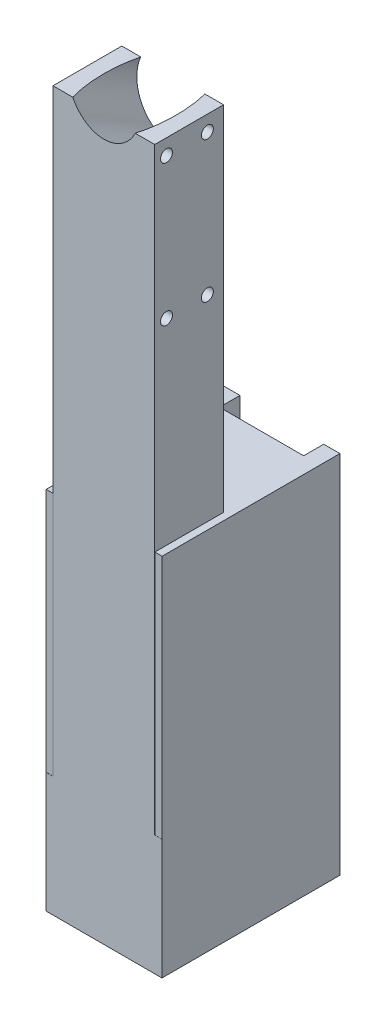
ISO-10303-21;
HEADER;
FILE_DESCRIPTION(('STEP AP214'),'2;1');
FILE_NAME('part.step','',(''),(''),'','','');
FILE_SCHEMA(('AUTOMOTIVE_DESIGN { 1 0 10303 214 1 1 1 1 }'));
ENDSEC;
DATA;
#1=APPLICATION_CONTEXT('core data for automotive mechanical design processes');
#2=APPLICATION_PROTOCOL_DEFINITION('international standard','automotive_design',2000,#1);
#3=PRODUCT_CONTEXT('',#1,'mechanical');
#4=PRODUCT('Part','Part','',(#3));
#5=PRODUCT_RELATED_PRODUCT_CATEGORY('part','',(#4));
#6=PRODUCT_DEFINITION_FORMATION('','',#4);
#7=PRODUCT_DEFINITION_CONTEXT('part definition',#1,'design');
#8=PRODUCT_DEFINITION('design','',#6,#7);
#9=PRODUCT_DEFINITION_SHAPE('','',#8);
#10=(LENGTH_UNIT() NAMED_UNIT(*) SI_UNIT(.MILLI.,.METRE.));
#11=(NAMED_UNIT(*) PLANE_ANGLE_UNIT() SI_UNIT($,.RADIAN.));
#12=(NAMED_UNIT(*) SI_UNIT($,.STERADIAN.) SOLID_ANGLE_UNIT());
#13=UNCERTAINTY_MEASURE_WITH_UNIT(LENGTH_MEASURE(1.E-05),#10,'distance_accuracy_value','');
#14=(GEOMETRIC_REPRESENTATION_CONTEXT(3) GLOBAL_UNCERTAINTY_ASSIGNED_CONTEXT((#13)) GLOBAL_UNIT_ASSIGNED_CONTEXT((#10,
#11,#12)) REPRESENTATION_CONTEXT('',''));
#15=CARTESIAN_POINT('',(0.,0.,0.));
#16=DIRECTION('',(0.,0.,1.));
#17=DIRECTION('',(1.,0.,0.));
#18=AXIS2_PLACEMENT_3D('',#15,#16,#17);
#19=CARTESIAN_POINT('',(19.2072159267695,-16.068623136154,-106.10825784731));
#20=DIRECTION('',(0.,1.,0.));
#21=DIRECTION('',(0.,0.,1.));
#22=AXIS2_PLACEMENT_3D('',#19,#20,#21);
#23=PLANE('',#22);
#24=DIRECTION('',(-1.,0.,0.));
#25=VECTOR('',#24,1.);
#26=CARTESIAN_POINT('',(-30.0724898141436,-16.068623136154,-197.871962443775));
#27=LINE('',#26,#25);
#28=CARTESIAN_POINT('',(-14.0724898141436,-16.068623136154,-197.871962443775));
#29=VERTEX_POINT('',#28);
#30=CARTESIAN_POINT('',(-30.0724898141436,-16.068623136154,-197.871962443775));
#31=VERTEX_POINT('',#30);
#32=EDGE_CURVE('E239',#29,#31,#27,.T.);
#33=ORIENTED_EDGE('',*,*,#32,.F.);
#34=DIRECTION('',(0.,0.,1.));
#35=VECTOR('',#34,1.);
#36=CARTESIAN_POINT('',(-14.0724898141436,-16.068623136154,-202.871962443775));
#37=LINE('',#36,#35);
#38=CARTESIAN_POINT('',(-14.0724898141436,-16.068623136154,-202.871962443775));
#39=VERTEX_POINT('',#38);
#40=EDGE_CURVE('E242',#39,#29,#37,.T.);
#41=ORIENTED_EDGE('',*,*,#40,.F.);
#42=DIRECTION('',(-1.,0.,0.));
#43=VECTOR('',#42,1.);
#44=CARTESIAN_POINT('',(-14.0724898141436,-16.068623136154,-202.871962443775));
#45=LINE('',#44,#43);
#46=CARTESIAN_POINT('',(-7.61117630883579,-16.068623136154,-202.871962443775));
#47=VERTEX_POINT('',#46);
#48=EDGE_CURVE('E245',#47,#39,#45,.T.);
#49=ORIENTED_EDGE('',*,*,#48,.F.);
#50=DIRECTION('',(0.,0.,-1.));
#51=VECTOR('',#50,1.);
#52=CARTESIAN_POINT('',(-7.61117630883579,-16.068623136154,-202.871962443775));
#53=LINE('',#52,#51);
#54=CARTESIAN_POINT('',(-7.61117630883579,-16.068623136154,-158.462370648886));
#55=VERTEX_POINT('',#54);
#56=EDGE_CURVE('E247',#55,#47,#53,.T.);
#57=ORIENTED_EDGE('',*,*,#56,.F.);
#58=DIRECTION('',(1.,0.,0.));
#59=VECTOR('',#58,1.);
#60=CARTESIAN_POINT('',(-34.8187430556122,-16.068623136154,-158.462370648886));
#61=LINE('',#60,#59);
#62=CARTESIAN_POINT('',(-36.5338033194513,-16.068623136154,-158.462370648886));
#63=VERTEX_POINT('',#62);
#64=EDGE_CURVE('E299',#63,#55,#61,.T.);
#65=ORIENTED_EDGE('',*,*,#64,.F.);
#66=DIRECTION('',(0.,0.,1.));
#67=VECTOR('',#66,1.);
#68=CARTESIAN_POINT('',(-36.5338033194513,-16.068623136154,-158.482956647581));
#69=LINE('',#68,#67);
#70=CARTESIAN_POINT('',(-36.5338033194513,-16.068623136154,-202.972596182978));
#71=VERTEX_POINT('',#70);
#72=EDGE_CURVE('E249',#71,#63,#69,.T.);
#73=ORIENTED_EDGE('',*,*,#72,.F.);
#74=DIRECTION('',(-1.,0.,0.));
#75=VECTOR('',#74,1.);
#76=CARTESIAN_POINT('',(-30.0724898141498,-16.068623136154,-202.972596182978));
#77=LINE('',#76,#75);
#78=CARTESIAN_POINT('',(-30.0724898141498,-16.068623136154,-202.972596182978));
#79=VERTEX_POINT('',#78);
#80=EDGE_CURVE('E251',#79,#71,#77,.T.);
#81=ORIENTED_EDGE('',*,*,#80,.F.);
#82=DIRECTION('',(-1.21891695342006E-12,0.,-1.));
#83=VECTOR('',#82,1.);
#84=CARTESIAN_POINT('',(-30.0724898141436,-16.068623136154,-197.871962443775));
#85=LINE('',#84,#83);
#86=EDGE_CURVE('E211',#31,#79,#85,.T.);
#87=ORIENTED_EDGE('',*,*,#86,.F.);
#88=EDGE_LOOP('',(#33,#41,#49,#57,#65,#73,#81,#87));
#89=FACE_BOUND('',#88,.T.);
#90=ADVANCED_FACE('F35',(#89),#23,.F.);
#91=CARTESIAN_POINT('',(-31.8187430556121,159.320219438313,-161.328506709392));
#92=DIRECTION('',(-1.,0.,0.));
#93=DIRECTION('',(0.,-1.,0.));
#94=AXIS2_PLACEMENT_3D('',#91,#92,#93);
#95=PLANE('',#94);
#96=CARTESIAN_POINT('',(-31.8187430556121,159.320219438313,-161.328506709392));
#97=DIRECTION('',(-1.,0.,0.));
#98=DIRECTION('',(0.,-1.,0.));
#99=AXIS2_PLACEMENT_3D('',#96,#97,#98);
#100=CIRCLE('',#99,1.49999999999987);
#101=CARTESIAN_POINT('',(-31.8187430556121,157.820219438313,-161.328506709392));
#102=VERTEX_POINT('',#101);
#103=EDGE_CURVE('E336',#102,#102,#100,.T.);
#104=ORIENTED_EDGE('',*,*,#103,.T.);
#105=EDGE_LOOP('',(#104));
#106=FACE_BOUND('',#105,.T.);
#107=ADVANCED_FACE('F465',(#106),#95,.T.);
#108=CARTESIAN_POINT('',(-31.8187430556121,159.320219438313,-171.596135726489));
#109=DIRECTION('',(-1.,0.,0.));
#110=DIRECTION('',(0.,-1.,0.));
#111=AXIS2_PLACEMENT_3D('',#108,#109,#110);
#112=PLANE('',#111);
#113=CARTESIAN_POINT('',(-31.8187430556121,159.320219438313,-171.596135726489));
#114=DIRECTION('',(-1.,0.,0.));
#115=DIRECTION('',(0.,-1.,0.));
#116=AXIS2_PLACEMENT_3D('',#113,#114,#115);
#117=CIRCLE('',#116,1.50000000000009);
#118=CARTESIAN_POINT('',(-31.8187430556121,157.820219438313,-171.596135726489));
#119=VERTEX_POINT('',#118);
#120=EDGE_CURVE('E332',#119,#119,#117,.T.);
#121=ORIENTED_EDGE('',*,*,#120,.T.);
#122=EDGE_LOOP('',(#121));
#123=FACE_BOUND('',#122,.T.);
#124=ADVANCED_FACE('F470',(#123),#112,.T.);
#125=CARTESIAN_POINT('',(-26.8187430556122,124.157221503448,-171.596135726489));
#126=DIRECTION('',(-1.,0.,0.));
#127=DIRECTION('',(0.,-1.,0.));
#128=AXIS2_PLACEMENT_3D('',#125,#126,#127);
#129=PLANE('',#128);
#130=CARTESIAN_POINT('',(-26.8187430556122,124.157221503448,-171.596135726489));
#131=DIRECTION('',(-1.,0.,0.));
#132=DIRECTION('',(0.,-1.,0.));
#133=AXIS2_PLACEMENT_3D('',#130,#131,#132);
#134=CIRCLE('',#133,1.50000000000002);
#135=CARTESIAN_POINT('',(-26.8187430556122,122.657221503448,-171.596135726489));
#136=VERTEX_POINT('',#135);
#137=EDGE_CURVE('E314',#136,#136,#134,.T.);
#138=ORIENTED_EDGE('',*,*,#137,.T.);
#139=EDGE_LOOP('',(#138));
#140=FACE_BOUND('',#139,.T.);
#141=ADVANCED_FACE('F505',(#140),#129,.T.);
#142=CARTESIAN_POINT('',(-26.8187430556122,124.157221503448,-161.390944698403));
#143=DIRECTION('',(-1.,0.,0.));
#144=DIRECTION('',(0.,-1.,0.));
#145=AXIS2_PLACEMENT_3D('',#142,#143,#144);
#146=PLANE('',#145);
#147=CARTESIAN_POINT('',(-26.8187430556122,124.157221503448,-161.390944698403));
#148=DIRECTION('',(-1.,0.,0.));
#149=DIRECTION('',(0.,-1.,0.));
#150=AXIS2_PLACEMENT_3D('',#147,#148,#149);
#151=CIRCLE('',#150,1.49999999999989);
#152=CARTESIAN_POINT('',(-26.8187430556122,122.657221503448,-161.390944698403));
#153=VERTEX_POINT('',#152);
#154=EDGE_CURVE('E310',#153,#153,#151,.T.);
#155=ORIENTED_EDGE('',*,*,#154,.T.);
#156=EDGE_LOOP('',(#155));
#157=FACE_BOUND('',#156,.T.);
#158=ADVANCED_FACE('F501',(#157),#146,.T.);
#159=CARTESIAN_POINT('',(-12.4187430556111,159.320219438313,-161.390944698403));
#160=DIRECTION('',(1.,0.,0.));
#161=DIRECTION('',(0.,1.,0.));
#162=AXIS2_PLACEMENT_3D('',#159,#160,#161);
#163=PLANE('',#162);
#164=CARTESIAN_POINT('',(-12.4187430556111,159.320219438313,-161.390944698403));
#165=DIRECTION('',(1.,0.,0.));
#166=DIRECTION('',(0.,1.,0.));
#167=AXIS2_PLACEMENT_3D('',#164,#165,#166);
#168=CIRCLE('',#167,1.50000000000031);
#169=CARTESIAN_POINT('',(-12.4187430556111,160.820219438313,-161.390944698403));
#170=VERTEX_POINT('',#169);
#171=EDGE_CURVE('E335',#170,#170,#168,.T.);
#172=ORIENTED_EDGE('',*,*,#171,.T.);
#173=EDGE_LOOP('',(#172));
#174=FACE_BOUND('',#173,.T.);
#175=ADVANCED_FACE('F504',(#174),#163,.T.);
#176=CARTESIAN_POINT('',(-12.4187430556111,159.320219438313,-171.596135726489));
#177=DIRECTION('',(1.,0.,0.));
#178=DIRECTION('',(0.,1.,0.));
#179=AXIS2_PLACEMENT_3D('',#176,#177,#178);
#180=PLANE('',#179);
#181=CARTESIAN_POINT('',(-12.4187430556111,159.320219438313,-171.596135726489));
#182=DIRECTION('',(1.,0.,0.));
#183=DIRECTION('',(0.,1.,0.));
#184=AXIS2_PLACEMENT_3D('',#181,#182,#183);
#185=CIRCLE('',#184,1.50000000000004);
#186=CARTESIAN_POINT('',(-12.4187430556111,160.820219438313,-171.596135726489));
#187=VERTEX_POINT('',#186);
#188=EDGE_CURVE('E344',#187,#187,#185,.T.);
#189=ORIENTED_EDGE('',*,*,#188,.T.);
#190=EDGE_LOOP('',(#189));
#191=FACE_BOUND('',#190,.T.);
#192=ADVANCED_FACE('F531',(#191),#180,.T.);
#193=CARTESIAN_POINT('',(-17.418743055611,124.157221503448,-161.390944698403));
#194=DIRECTION('',(1.,0.,0.));
#195=DIRECTION('',(0.,1.,0.));
#196=AXIS2_PLACEMENT_3D('',#193,#194,#195);
#197=PLANE('',#196);
#198=CARTESIAN_POINT('',(-17.418743055611,124.157221503448,-161.390944698403));
#199=DIRECTION('',(1.,0.,0.));
#200=DIRECTION('',(0.,1.,0.));
#201=AXIS2_PLACEMENT_3D('',#198,#199,#200);
#202=CIRCLE('',#201,1.49999999999993);
#203=CARTESIAN_POINT('',(-17.418743055611,125.657221503448,-161.390944698403));
#204=VERTEX_POINT('',#203);
#205=EDGE_CURVE('E322',#204,#204,#202,.T.);
#206=ORIENTED_EDGE('',*,*,#205,.T.);
#207=EDGE_LOOP('',(#206));
#208=FACE_BOUND('',#207,.T.);
#209=ADVANCED_FACE('F523',(#208),#197,.T.);
#210=CARTESIAN_POINT('',(-17.418743055611,124.157221503448,-171.596135726489));
#211=DIRECTION('',(1.,0.,0.));
#212=DIRECTION('',(0.,1.,0.));
#213=AXIS2_PLACEMENT_3D('',#210,#211,#212);
#214=PLANE('',#213);
#215=CARTESIAN_POINT('',(-17.418743055611,124.157221503448,-171.596135726489));
#216=DIRECTION('',(1.,0.,0.));
#217=DIRECTION('',(0.,1.,0.));
#218=AXIS2_PLACEMENT_3D('',#215,#216,#217);
#219=CIRCLE('',#218,1.50000000000008);
#220=CARTESIAN_POINT('',(-17.418743055611,125.657221503448,-171.596135726489));
#221=VERTEX_POINT('',#220);
#222=EDGE_CURVE('E318',#221,#221,#219,.T.);
#223=ORIENTED_EDGE('',*,*,#222,.T.);
#224=EDGE_LOOP('',(#223));
#225=FACE_BOUND('',#224,.T.);
#226=ADVANCED_FACE('F519',(#225),#214,.T.);
#227=CARTESIAN_POINT('',(-22.0724898141436,17.3425690276545,-192.871962443775));
#228=DIRECTION('',(0.,0.,-1.));
#229=DIRECTION('',(0.,1.,0.));
#230=AXIS2_PLACEMENT_3D('',#227,#228,#229);
#231=PLANE('',#230);
#232=CARTESIAN_POINT('',(-22.0724898141436,17.3425690276545,-192.871962443775));
#233=DIRECTION('',(0.,0.,-1.));
#234=DIRECTION('',(0.,1.,0.));
#235=AXIS2_PLACEMENT_3D('',#232,#233,#234);
#236=CIRCLE('',#235,1.40000000000023);
#237=CARTESIAN_POINT('',(-22.0724898141436,18.7425690276547,-192.871962443775));
#238=VERTEX_POINT('',#237);
#239=EDGE_CURVE('E254',#238,#238,#236,.T.);
#240=ORIENTED_EDGE('',*,*,#239,.T.);
#241=EDGE_LOOP('',(#240));
#242=FACE_BOUND('',#241,.T.);
#243=ADVANCED_FACE('F522',(#242),#231,.T.);
#244=CARTESIAN_POINT('',(-22.0724898141436,63.4073768638466,-192.871962443775));
#245=DIRECTION('',(0.,0.,-1.));
#246=DIRECTION('',(0.,1.,0.));
#247=AXIS2_PLACEMENT_3D('',#244,#245,#246);
#248=PLANE('',#247);
#249=CARTESIAN_POINT('',(-22.0724898141436,63.4073768638466,-192.871962443775));
#250=DIRECTION('',(0.,0.,-1.));
#251=DIRECTION('',(0.,1.,0.));
#252=AXIS2_PLACEMENT_3D('',#249,#250,#251);
#253=CIRCLE('',#252,1.40000000000023);
#254=CARTESIAN_POINT('',(-22.0724898141436,64.8073768638468,-192.871962443775));
#255=VERTEX_POINT('',#254);
#256=EDGE_CURVE('E271',#255,#255,#253,.T.);
#257=ORIENTED_EDGE('',*,*,#256,.T.);
#258=EDGE_LOOP('',(#257));
#259=FACE_BOUND('',#258,.T.);
#260=ADVANCED_FACE('F544',(#259),#248,.T.);
#261=CARTESIAN_POINT('',(-37.8187430556123,159.320219438313,-161.328506709392));
#262=DIRECTION('',(1.,0.,0.));
#263=DIRECTION('',(0.,1.,0.));
#264=AXIS2_PLACEMENT_3D('',#261,#262,#263);
#265=CYLINDRICAL_SURFACE('',#264,1.49999999999987);
#266=ORIENTED_EDGE('',*,*,#103,.F.);
#267=EDGE_LOOP('',(#266));
#268=FACE_BOUND('',#267,.T.);
#269=CARTESIAN_POINT('',(-34.8187430556122,159.320219438313,-161.328506709392));
#270=DIRECTION('',(1.,0.,0.));
#271=DIRECTION('',(0.,1.,0.));
#272=AXIS2_PLACEMENT_3D('',#269,#270,#271);
#273=CIRCLE('',#272,1.49999999999987);
#274=CARTESIAN_POINT('',(-34.8187430556122,160.820219438313,-161.328506709392));
#275=VERTEX_POINT('',#274);
#276=EDGE_CURVE('E331',#275,#275,#273,.F.);
#277=ORIENTED_EDGE('',*,*,#276,.T.);
#278=EDGE_LOOP('',(#277));
#279=FACE_BOUND('',#278,.T.);
#280=ADVANCED_FACE('F538',(#268,#279),#265,.F.);
#281=CARTESIAN_POINT('',(-37.8187430556123,159.320219438313,-171.596135726489));
#282=DIRECTION('',(1.,0.,0.));
#283=DIRECTION('',(0.,1.,0.));
#284=AXIS2_PLACEMENT_3D('',#281,#282,#283);
#285=CYLINDRICAL_SURFACE('',#284,1.50000000000009);
#286=ORIENTED_EDGE('',*,*,#120,.F.);
#287=EDGE_LOOP('',(#286));
#288=FACE_BOUND('',#287,.T.);
#289=CARTESIAN_POINT('',(-34.8187430556122,159.320219438313,-171.596135726489));
#290=DIRECTION('',(1.,0.,0.));
#291=DIRECTION('',(0.,1.,0.));
#292=AXIS2_PLACEMENT_3D('',#289,#290,#291);
#293=CIRCLE('',#292,1.50000000000009);
#294=CARTESIAN_POINT('',(-34.8187430556122,160.820219438313,-171.596135726489));
#295=VERTEX_POINT('',#294);
#296=EDGE_CURVE('E339',#295,#295,#293,.F.);
#297=ORIENTED_EDGE('',*,*,#296,.T.);
#298=EDGE_LOOP('',(#297));
#299=FACE_BOUND('',#298,.T.);
#300=ADVANCED_FACE('F509',(#288,#299),#285,.F.);
#301=CARTESIAN_POINT('',(-51.9131890577844,124.157221503448,-171.596135726489));
#302=DIRECTION('',(1.,0.,0.));
#303=DIRECTION('',(0.,1.,0.));
#304=AXIS2_PLACEMENT_3D('',#301,#302,#303);
#305=CYLINDRICAL_SURFACE('',#304,1.50000000000002);
#306=ORIENTED_EDGE('',*,*,#137,.F.);
#307=EDGE_LOOP('',(#306));
#308=FACE_BOUND('',#307,.T.);
#309=CARTESIAN_POINT('',(-34.8187430556122,124.157221503448,-171.596135726489));
#310=DIRECTION('',(1.,0.,0.));
#311=DIRECTION('',(0.,1.,0.));
#312=AXIS2_PLACEMENT_3D('',#309,#310,#311);
#313=CIRCLE('',#312,1.50000000000002);
#314=CARTESIAN_POINT('',(-34.8187430556122,125.657221503448,-171.596135726489));
#315=VERTEX_POINT('',#314);
#316=EDGE_CURVE('E301',#315,#315,#313,.F.);
#317=ORIENTED_EDGE('',*,*,#316,.T.);
#318=EDGE_LOOP('',(#317));
#319=FACE_BOUND('',#318,.T.);
#320=ADVANCED_FACE('F499',(#308,#319),#305,.F.);
#321=CARTESIAN_POINT('',(-51.9131890577844,124.157221503448,-161.390944698403));
#322=DIRECTION('',(1.,0.,0.));
#323=DIRECTION('',(0.,1.,0.));
#324=AXIS2_PLACEMENT_3D('',#321,#322,#323);
#325=CYLINDRICAL_SURFACE('',#324,1.49999999999989);
#326=ORIENTED_EDGE('',*,*,#154,.F.);
#327=EDGE_LOOP('',(#326));
#328=FACE_BOUND('',#327,.T.);
#329=CARTESIAN_POINT('',(-34.8187430556122,124.157221503448,-161.390944698403));
#330=DIRECTION('',(1.,0.,0.));
#331=DIRECTION('',(0.,1.,0.));
#332=AXIS2_PLACEMENT_3D('',#329,#330,#331);
#333=CIRCLE('',#332,1.49999999999989);
#334=CARTESIAN_POINT('',(-34.8187430556122,125.657221503448,-161.390944698403));
#335=VERTEX_POINT('',#334);
#336=EDGE_CURVE('E317',#335,#335,#333,.F.);
#337=ORIENTED_EDGE('',*,*,#336,.T.);
#338=EDGE_LOOP('',(#337));
#339=FACE_BOUND('',#338,.T.);
#340=ADVANCED_FACE('F491',(#328,#339),#325,.F.);
#341=CARTESIAN_POINT('',(-34.8187430556122,193.866566084655,-175.642963086767));
#342=DIRECTION('',(0.,0.,1.));
#343=DIRECTION('',(0.,-1.,0.));
#344=AXIS2_PLACEMENT_3D('',#341,#342,#343);
#345=PLANE('',#344);
#346=DIRECTION('',(1.,0.,0.));
#347=VECTOR('',#346,1.);
#348=CARTESIAN_POINT('',(-34.8187430556122,163.20172047088,-175.642963086767));
#349=LINE('',#348,#347);
#350=CARTESIAN_POINT('',(-34.8187430556122,163.20172047088,-175.642963086767));
#351=VERTEX_POINT('',#350);
#352=CARTESIAN_POINT('',(-30.0900033985068,163.20172047088,-175.642963086767));
#353=VERTEX_POINT('',#352);
#354=EDGE_CURVE('E284',#351,#353,#349,.T.);
#355=ORIENTED_EDGE('',*,*,#354,.T.);
#356=CARTESIAN_POINT('',(-22.0782108200712,158.467282147258,-175.642963086767));
#357=DIRECTION('',(0.,0.,1.));
#358=DIRECTION('',(0.,1.,0.));
#359=AXIS2_PLACEMENT_3D('',#356,#357,#358);
#360=ELLIPSE('',#359,10.3923048454137,9.00000000000035);
#361=CARTESIAN_POINT('',(-14.0664182416357,163.20172047088,-175.642963086767));
#362=VERTEX_POINT('',#361);
#363=EDGE_CURVE('E321',#353,#362,#360,.T.);
#364=ORIENTED_EDGE('',*,*,#363,.T.);
#365=CARTESIAN_POINT('',(-9.41874305561097,163.20172047088,-175.642963086767));
#366=VERTEX_POINT('',#365);
#367=EDGE_CURVE('E287',#362,#366,#349,.T.);
#368=ORIENTED_EDGE('',*,*,#367,.T.);
#369=DIRECTION('',(0.,-1.,0.));
#370=VECTOR('',#369,1.);
#371=CARTESIAN_POINT('',(-9.41874305561097,193.866566084655,-175.642963086767));
#372=LINE('',#371,#370);
#373=CARTESIAN_POINT('',(-9.41874305561097,75.0913768638464,-175.642963086767));
#374=VERTEX_POINT('',#373);
#375=EDGE_CURVE('E294',#366,#374,#372,.T.);
#376=ORIENTED_EDGE('',*,*,#375,.T.);
#377=DIRECTION('',(1.,0.,0.));
#378=VECTOR('',#377,1.);
#379=CARTESIAN_POINT('',(-4650.0806785395,75.0913768638464,-175.642963086767));
#380=LINE('',#379,#378);
#381=CARTESIAN_POINT('',(-34.8187430556122,75.0913768638464,-175.642963086767));
#382=VERTEX_POINT('',#381);
#383=EDGE_CURVE('E220',#382,#374,#380,.T.);
#384=ORIENTED_EDGE('',*,*,#383,.F.);
#385=DIRECTION('',(0.,-1.,0.));
#386=VECTOR('',#385,1.);
#387=CARTESIAN_POINT('',(-34.8187430556122,193.866566084655,-175.642963086767));
#388=LINE('',#387,#386);
#389=EDGE_CURVE('E297',#351,#382,#388,.T.);
#390=ORIENTED_EDGE('',*,*,#389,.F.);
#391=EDGE_LOOP('',(#355,#364,#368,#376,#384,#390));
#392=FACE_BOUND('',#391,.T.);
#393=ADVANCED_FACE('F427',(#392),#345,.F.);
#394=CARTESIAN_POINT('',(-12.4187430556111,159.320219438313,-161.390944698403));
#395=DIRECTION('',(1.,0.,0.));
#396=DIRECTION('',(0.,1.,0.));
#397=AXIS2_PLACEMENT_3D('',#394,#395,#396);
#398=CYLINDRICAL_SURFACE('',#397,1.50000000000031);
#399=ORIENTED_EDGE('',*,*,#171,.F.);
#400=EDGE_LOOP('',(#399));
#401=FACE_BOUND('',#400,.T.);
#402=CARTESIAN_POINT('',(-9.41874305561097,159.320219438313,-161.390944698403));
#403=DIRECTION('',(1.,0.,0.));
#404=DIRECTION('',(0.,1.,0.));
#405=AXIS2_PLACEMENT_3D('',#402,#403,#404);
#406=CIRCLE('',#405,1.50000000000031);
#407=CARTESIAN_POINT('',(-9.41874305561097,160.820219438313,-161.390944698403));
#408=VERTEX_POINT('',#407);
#409=EDGE_CURVE('E347',#408,#408,#406,.T.);
#410=ORIENTED_EDGE('',*,*,#409,.T.);
#411=EDGE_LOOP('',(#410));
#412=FACE_BOUND('',#411,.T.);
#413=ADVANCED_FACE('F490',(#401,#412),#398,.F.);
#414=CARTESIAN_POINT('',(-12.4187430556111,159.320219438313,-171.596135726489));
#415=DIRECTION('',(1.,0.,0.));
#416=DIRECTION('',(0.,1.,0.));
#417=AXIS2_PLACEMENT_3D('',#414,#415,#416);
#418=CYLINDRICAL_SURFACE('',#417,1.50000000000004);
#419=ORIENTED_EDGE('',*,*,#188,.F.);
#420=EDGE_LOOP('',(#419));
#421=FACE_BOUND('',#420,.T.);
#422=CARTESIAN_POINT('',(-9.41874305561097,159.320219438313,-171.596135726489));
#423=DIRECTION('',(1.,0.,0.));
#424=DIRECTION('',(0.,1.,0.));
#425=AXIS2_PLACEMENT_3D('',#422,#423,#424);
#426=CIRCLE('',#425,1.50000000000004);
#427=CARTESIAN_POINT('',(-9.41874305561097,160.820219438313,-171.596135726489));
#428=VERTEX_POINT('',#427);
#429=EDGE_CURVE('E340',#428,#428,#426,.T.);
#430=ORIENTED_EDGE('',*,*,#429,.T.);
#431=EDGE_LOOP('',(#430));
#432=FACE_BOUND('',#431,.T.);
#433=ADVANCED_FACE('F527',(#421,#432),#418,.F.);
#434=CARTESIAN_POINT('',(5.58125694438871,124.157221503448,-161.390944698403));
#435=DIRECTION('',(-1.,0.,0.));
#436=DIRECTION('',(0.,-1.,0.));
#437=AXIS2_PLACEMENT_3D('',#434,#435,#436);
#438=CYLINDRICAL_SURFACE('',#437,1.49999999999993);
#439=ORIENTED_EDGE('',*,*,#205,.F.);
#440=EDGE_LOOP('',(#439));
#441=FACE_BOUND('',#440,.T.);
#442=CARTESIAN_POINT('',(-9.41874305561097,124.157221503448,-161.390944698403));
#443=DIRECTION('',(-1.,0.,0.));
#444=DIRECTION('',(0.,-1.,0.));
#445=AXIS2_PLACEMENT_3D('',#442,#443,#444);
#446=CIRCLE('',#445,1.49999999999993);
#447=CARTESIAN_POINT('',(-9.41874305561097,122.657221503448,-161.390944698403));
#448=VERTEX_POINT('',#447);
#449=EDGE_CURVE('E313',#448,#448,#446,.F.);
#450=ORIENTED_EDGE('',*,*,#449,.T.);
#451=EDGE_LOOP('',(#450));
#452=FACE_BOUND('',#451,.T.);
#453=ADVANCED_FACE('F517',(#441,#452),#438,.F.);
#454=CARTESIAN_POINT('',(5.58125694438871,124.157221503448,-171.596135726489));
#455=DIRECTION('',(-1.,0.,0.));
#456=DIRECTION('',(0.,-1.,0.));
#457=AXIS2_PLACEMENT_3D('',#454,#455,#456);
#458=CYLINDRICAL_SURFACE('',#457,1.50000000000008);
#459=ORIENTED_EDGE('',*,*,#222,.F.);
#460=EDGE_LOOP('',(#459));
#461=FACE_BOUND('',#460,.T.);
#462=CARTESIAN_POINT('',(-9.41874305561097,124.157221503448,-171.596135726489));
#463=DIRECTION('',(-1.,0.,0.));
#464=DIRECTION('',(0.,-1.,0.));
#465=AXIS2_PLACEMENT_3D('',#462,#463,#464);
#466=CIRCLE('',#465,1.50000000000008);
#467=CARTESIAN_POINT('',(-9.41874305561097,122.657221503448,-171.596135726489));
#468=VERTEX_POINT('',#467);
#469=EDGE_CURVE('E325',#468,#468,#466,.F.);
#470=ORIENTED_EDGE('',*,*,#469,.T.);
#471=EDGE_LOOP('',(#470));
#472=FACE_BOUND('',#471,.T.);
#473=ADVANCED_FACE('F514',(#461,#472),#458,.F.);
#474=CARTESIAN_POINT('',(-30.0724898141498,75.0913768638464,-202.972596182978));
#475=DIRECTION('',(0.,0.,1.));
#476=DIRECTION('',(0.,-1.,0.));
#477=AXIS2_PLACEMENT_3D('',#474,#475,#476);
#478=PLANE('',#477);
#479=DIRECTION('',(0.,-1.,0.));
#480=VECTOR('',#479,1.);
#481=CARTESIAN_POINT('',(-32.6500511804566,75.0913768638464,-202.972596182978));
#482=LINE('',#481,#480);
#483=CARTESIAN_POINT('',(-32.6500511804566,75.0913768638464,-202.972596182978));
#484=VERTEX_POINT('',#483);
#485=CARTESIAN_POINT('',(-32.6500511804566,3.30098404346657,-202.972596182978));
#486=VERTEX_POINT('',#485);
#487=EDGE_CURVE('E44',#484,#486,#482,.T.);
#488=ORIENTED_EDGE('',*,*,#487,.T.);
#489=DIRECTION('',(1.,0.,0.));
#490=VECTOR('',#489,1.);
#491=CARTESIAN_POINT('',(-32.6500511804566,3.30098404346657,-202.972596182978));
#492=LINE('',#491,#490);
#493=CARTESIAN_POINT('',(-30.0724898141498,3.30098404346657,-202.972596182978));
#494=VERTEX_POINT('',#493);
#495=EDGE_CURVE('E38',#486,#494,#492,.T.);
#496=ORIENTED_EDGE('',*,*,#495,.T.);
#497=DIRECTION('',(0.,-1.,0.));
#498=VECTOR('',#497,1.);
#499=CARTESIAN_POINT('',(-30.0724898141498,75.0913768638464,-202.972596182978));
#500=LINE('',#499,#498);
#501=EDGE_CURVE('E206',#494,#79,#500,.T.);
#502=ORIENTED_EDGE('',*,*,#501,.T.);
#503=ORIENTED_EDGE('',*,*,#80,.T.);
#504=DIRECTION('',(0.,-1.,0.));
#505=VECTOR('',#504,1.);
#506=CARTESIAN_POINT('',(-36.5338033194513,75.0913768638464,-202.972596182978));
#507=LINE('',#506,#505);
#508=CARTESIAN_POINT('',(-36.5338033194513,75.0913768638464,-202.972596182978));
#509=VERTEX_POINT('',#508);
#510=EDGE_CURVE('E213',#509,#71,#507,.T.);
#511=ORIENTED_EDGE('',*,*,#510,.F.);
#512=DIRECTION('',(-1.,0.,0.));
#513=VECTOR('',#512,1.);
#514=CARTESIAN_POINT('',(-30.0724898141498,75.0913768638464,-202.972596182978));
#515=LINE('',#514,#513);
#516=EDGE_CURVE('E243',#484,#509,#515,.T.);
#517=ORIENTED_EDGE('',*,*,#516,.F.);
#518=EDGE_LOOP('',(#488,#496,#502,#503,#511,#517));
#519=FACE_BOUND('',#518,.T.);
#520=ADVANCED_FACE('F205',(#519),#478,.F.);
#521=CARTESIAN_POINT('',(-14.072489814156,75.0913768638464,-158.482956647581));
#522=DIRECTION('',(0.,0.,-1.));
#523=DIRECTION('',(0.,1.,0.));
#524=AXIS2_PLACEMENT_3D('',#521,#522,#523);
#525=PLANE('',#524);
#526=DIRECTION('',(-1.,0.,0.));
#527=VECTOR('',#526,1.);
#528=CARTESIAN_POINT('',(-4650.0806785395,13.9313768638463,-158.482956647581));
#529=LINE('',#528,#527);
#530=CARTESIAN_POINT('',(-34.8187430556122,13.9313768638463,-158.482956647581));
#531=VERTEX_POINT('',#530);
#532=CARTESIAN_POINT('',(-36.5338033194513,13.9313768638463,-158.482956647581));
#533=VERTEX_POINT('',#532);
#534=EDGE_CURVE('E369',#531,#533,#529,.T.);
#535=ORIENTED_EDGE('',*,*,#534,.F.);
#536=DIRECTION('',(0.,-1.,0.));
#537=VECTOR('',#536,1.);
#538=CARTESIAN_POINT('',(-34.8187430556122,75.0913768638464,-158.482956647581));
#539=LINE('',#538,#537);
#540=CARTESIAN_POINT('',(-34.8187430556122,75.0913768638464,-158.482956647581));
#541=VERTEX_POINT('',#540);
#542=EDGE_CURVE('E281',#541,#531,#539,.T.);
#543=ORIENTED_EDGE('',*,*,#542,.F.);
#544=DIRECTION('',(1.,0.,0.));
#545=VECTOR('',#544,1.);
#546=CARTESIAN_POINT('',(-30.0724898141436,75.0913768638464,-158.482956647581));
#547=LINE('',#546,#545);
#548=CARTESIAN_POINT('',(-36.5338033194513,75.0913768638464,-158.482956647581));
#549=VERTEX_POINT('',#548);
#550=EDGE_CURVE('E261',#549,#541,#547,.T.);
#551=ORIENTED_EDGE('',*,*,#550,.F.);
#552=DIRECTION('',(0.,-1.,0.));
#553=VECTOR('',#552,1.);
#554=CARTESIAN_POINT('',(-36.5338033194513,75.0913768638464,-158.482956647581));
#555=LINE('',#554,#553);
#556=EDGE_CURVE('E217',#549,#533,#555,.T.);
#557=ORIENTED_EDGE('',*,*,#556,.T.);
#558=EDGE_LOOP('',(#535,#543,#551,#557));
#559=FACE_BOUND('',#558,.T.);
#560=ADVANCED_FACE('F565',(#559),#525,.F.);
#561=CARTESIAN_POINT('',(-7.61117630883579,13.9313768638463,-158.482956647581));
#562=VERTEX_POINT('',#561);
#563=CARTESIAN_POINT('',(-9.41874305561097,13.9313768638463,-158.482956647581));
#564=VERTEX_POINT('',#563);
#565=EDGE_CURVE('E360',#562,#564,#529,.T.);
#566=ORIENTED_EDGE('',*,*,#565,.F.);
#567=DIRECTION('',(0.,-1.,0.));
#568=VECTOR('',#567,1.);
#569=CARTESIAN_POINT('',(-7.61117630883579,75.0913768638464,-158.482956647581));
#570=LINE('',#569,#568);
#571=CARTESIAN_POINT('',(-7.61117630883579,75.0913768638464,-158.482956647581));
#572=VERTEX_POINT('',#571);
#573=EDGE_CURVE('E225',#572,#562,#570,.T.);
#574=ORIENTED_EDGE('',*,*,#573,.F.);
#575=CARTESIAN_POINT('',(-9.41874305561097,75.0913768638464,-158.482956647581));
#576=VERTEX_POINT('',#575);
#577=EDGE_CURVE('E264',#576,#572,#547,.T.);
#578=ORIENTED_EDGE('',*,*,#577,.F.);
#579=DIRECTION('',(0.,1.,0.));
#580=VECTOR('',#579,1.);
#581=CARTESIAN_POINT('',(-9.41874305561097,75.0913768638464,-158.482956647581));
#582=LINE('',#581,#580);
#583=EDGE_CURVE('E277',#564,#576,#582,.T.);
#584=ORIENTED_EDGE('',*,*,#583,.F.);
#585=EDGE_LOOP('',(#566,#574,#578,#584));
#586=FACE_BOUND('',#585,.T.);
#587=ADVANCED_FACE('F435',(#586),#525,.F.);
#588=CARTESIAN_POINT('',(-32.6500511804566,75.0913768638464,-123.075531047513));
#589=DIRECTION('',(1.,0.,0.));
#590=DIRECTION('',(0.,1.,0.));
#591=AXIS2_PLACEMENT_3D('',#588,#589,#590);
#592=PLANE('',#591);
#593=DIRECTION('',(0.,-1.,0.));
#594=VECTOR('',#593,1.);
#595=CARTESIAN_POINT('',(-32.6500511804566,75.0913768638464,-197.871962443775));
#596=LINE('',#595,#594);
#597=CARTESIAN_POINT('',(-32.6500511804566,75.0913768638464,-197.871962443775));
#598=VERTEX_POINT('',#597);
#599=CARTESIAN_POINT('',(-32.6500511804566,3.30098404346657,-197.871962443775));
#600=VERTEX_POINT('',#599);
#601=EDGE_CURVE('E382',#598,#600,#596,.T.);
#602=ORIENTED_EDGE('',*,*,#601,.T.);
#603=DIRECTION('',(0.,0.,-1.));
#604=VECTOR('',#603,1.);
#605=CARTESIAN_POINT('',(-32.6500511804566,3.30098404346657,-123.075531047513));
#606=LINE('',#605,#604);
#607=EDGE_CURVE('E208',#600,#486,#606,.T.);
#608=ORIENTED_EDGE('',*,*,#607,.T.);
#609=ORIENTED_EDGE('',*,*,#487,.F.);
#610=DIRECTION('',(0.,0.,-1.));
#611=VECTOR('',#610,1.);
#612=CARTESIAN_POINT('',(-32.6500511804566,75.0913768638464,-123.075531047513));
#613=LINE('',#612,#611);
#614=EDGE_CURVE('E11',#598,#484,#613,.T.);
#615=ORIENTED_EDGE('',*,*,#614,.F.);
#616=EDGE_LOOP('',(#602,#608,#609,#615));
#617=FACE_BOUND('',#616,.T.);
#618=ADVANCED_FACE('F463',(#617),#592,.T.);
#619=CARTESIAN_POINT('',(-32.6500511804566,3.30098404346657,-123.075531047513));
#620=DIRECTION('',(0.,1.,0.));
#621=DIRECTION('',(0.,0.,1.));
#622=AXIS2_PLACEMENT_3D('',#619,#620,#621);
#623=PLANE('',#622);
#624=DIRECTION('',(-1.21891695342006E-12,0.,-1.));
#625=VECTOR('',#624,1.);
#626=CARTESIAN_POINT('',(-30.0724898141436,3.30098404346657,-197.871962443775));
#627=LINE('',#626,#625);
#628=CARTESIAN_POINT('',(-30.0724898141436,3.30098404346657,-197.871962443775));
#629=VERTEX_POINT('',#628);
#630=EDGE_CURVE('E193',#629,#494,#627,.T.);
#631=ORIENTED_EDGE('',*,*,#630,.T.);
#632=ORIENTED_EDGE('',*,*,#495,.F.);
#633=ORIENTED_EDGE('',*,*,#607,.F.);
#634=DIRECTION('',(1.,0.,0.));
#635=VECTOR('',#634,1.);
#636=CARTESIAN_POINT('',(-32.6500511804566,3.30098404346657,-197.871962443775));
#637=LINE('',#636,#635);
#638=EDGE_CURVE('E82',#600,#629,#637,.T.);
#639=ORIENTED_EDGE('',*,*,#638,.T.);
#640=EDGE_LOOP('',(#631,#632,#633,#639));
#641=FACE_BOUND('',#640,.T.);
#642=ADVANCED_FACE('F195',(#641),#623,.T.);
#643=CARTESIAN_POINT('',(-30.0724898141436,75.0913768638464,-197.871962443775));
#644=DIRECTION('',(-1.,0.,1.21891695342006E-12));
#645=DIRECTION('',(1.21891695342006E-12,0.,1.));
#646=AXIS2_PLACEMENT_3D('',#643,#644,#645);
#647=PLANE('',#646);
#648=ORIENTED_EDGE('',*,*,#630,.F.);
#649=DIRECTION('',(0.,-1.,0.));
#650=VECTOR('',#649,1.);
#651=CARTESIAN_POINT('',(-30.0724898141436,75.0913768638464,-197.871962443775));
#652=LINE('',#651,#650);
#653=EDGE_CURVE('E237',#629,#31,#652,.T.);
#654=ORIENTED_EDGE('',*,*,#653,.T.);
#655=ORIENTED_EDGE('',*,*,#86,.T.);
#656=ORIENTED_EDGE('',*,*,#501,.F.);
#657=EDGE_LOOP('',(#648,#654,#655,#656));
#658=FACE_BOUND('',#657,.T.);
#659=ADVANCED_FACE('F210',(#658),#647,.F.);
#660=CARTESIAN_POINT('',(-14.0724898141436,75.0913768638464,-202.871962443775));
#661=DIRECTION('',(1.,0.,0.));
#662=DIRECTION('',(0.,1.,0.));
#663=AXIS2_PLACEMENT_3D('',#660,#661,#662);
#664=PLANE('',#663);
#665=DIRECTION('',(0.,0.,1.));
#666=VECTOR('',#665,1.);
#667=CARTESIAN_POINT('',(-14.0724898141436,3.30098404346657,-202.871962443775));
#668=LINE('',#667,#666);
#669=CARTESIAN_POINT('',(-14.0724898141436,3.30098404346657,-202.871962443775));
#670=VERTEX_POINT('',#669);
#671=CARTESIAN_POINT('',(-14.0724898141436,3.30098404346657,-197.871962443775));
#672=VERTEX_POINT('',#671);
#673=EDGE_CURVE('E377',#670,#672,#668,.T.);
#674=ORIENTED_EDGE('',*,*,#673,.F.);
#675=DIRECTION('',(0.,-1.,0.));
#676=VECTOR('',#675,1.);
#677=CARTESIAN_POINT('',(-14.0724898141436,75.0913768638464,-202.871962443775));
#678=LINE('',#677,#676);
#679=EDGE_CURVE('E231',#670,#39,#678,.T.);
#680=ORIENTED_EDGE('',*,*,#679,.T.);
#681=ORIENTED_EDGE('',*,*,#40,.T.);
#682=DIRECTION('',(0.,-1.,0.));
#683=VECTOR('',#682,1.);
#684=CARTESIAN_POINT('',(-14.0724898141436,75.0913768638464,-197.871962443775));
#685=LINE('',#684,#683);
#686=EDGE_CURVE('E234',#672,#29,#685,.T.);
#687=ORIENTED_EDGE('',*,*,#686,.F.);
#688=EDGE_LOOP('',(#674,#680,#681,#687));
#689=FACE_BOUND('',#688,.T.);
#690=ADVANCED_FACE('F451',(#689),#664,.F.);
#691=DIRECTION('',(-1.,0.,0.));
#692=VECTOR('',#691,1.);
#693=CARTESIAN_POINT('',(-14.0724898141436,3.30098404346657,-202.871962443775));
#694=LINE('',#693,#692);
#695=CARTESIAN_POINT('',(-11.6584898209169,3.30098404346657,-202.871962443775));
#696=VERTEX_POINT('',#695);
#697=EDGE_CURVE('E200',#696,#670,#694,.T.);
#698=ORIENTED_EDGE('',*,*,#697,.T.);
#699=ORIENTED_EDGE('',*,*,#673,.T.);
#700=CARTESIAN_POINT('',(-11.6584898209169,3.30098404346657,-197.871962443775));
#701=VERTEX_POINT('',#700);
#702=EDGE_CURVE('E66',#672,#701,#637,.T.);
#703=ORIENTED_EDGE('',*,*,#702,.T.);
#704=DIRECTION('',(0.,0.,-1.));
#705=VECTOR('',#704,1.);
#706=CARTESIAN_POINT('',(-11.6584898209169,3.30098404346657,-123.075531047513));
#707=LINE('',#706,#705);
#708=EDGE_CURVE('E209',#701,#696,#707,.T.);
#709=ORIENTED_EDGE('',*,*,#708,.T.);
#710=EDGE_LOOP('',(#698,#699,#703,#709));
#711=FACE_BOUND('',#710,.T.);
#712=ADVANCED_FACE('F453',(#711),#623,.T.);
#713=CARTESIAN_POINT('',(-11.6584898209169,75.0913768638464,-123.075531047513));
#714=DIRECTION('',(-1.,0.,0.));
#715=DIRECTION('',(0.,-1.,0.));
#716=AXIS2_PLACEMENT_3D('',#713,#714,#715);
#717=PLANE('',#716);
#718=DIRECTION('',(0.,-1.,0.));
#719=VECTOR('',#718,1.);
#720=CARTESIAN_POINT('',(-11.6584898209169,75.0913768638464,-202.871962443775));
#721=LINE('',#720,#719);
#722=CARTESIAN_POINT('',(-11.6584898209169,75.0913768638464,-202.871962443775));
#723=VERTEX_POINT('',#722);
#724=EDGE_CURVE('E399',#723,#696,#721,.T.);
#725=ORIENTED_EDGE('',*,*,#724,.T.);
#726=ORIENTED_EDGE('',*,*,#708,.F.);
#727=DIRECTION('',(0.,1.,0.));
#728=VECTOR('',#727,1.);
#729=CARTESIAN_POINT('',(-11.6584898209169,75.0913768638464,-197.871962443775));
#730=LINE('',#729,#728);
#731=CARTESIAN_POINT('',(-11.6584898209169,75.0913768638464,-197.871962443775));
#732=VERTEX_POINT('',#731);
#733=EDGE_CURVE('E378',#701,#732,#730,.T.);
#734=ORIENTED_EDGE('',*,*,#733,.T.);
#735=DIRECTION('',(0.,0.,-1.));
#736=VECTOR('',#735,1.);
#737=CARTESIAN_POINT('',(-11.6584898209169,75.0913768638464,-123.075531047513));
#738=LINE('',#737,#736);
#739=EDGE_CURVE('E380',#732,#723,#738,.T.);
#740=ORIENTED_EDGE('',*,*,#739,.T.);
#741=EDGE_LOOP('',(#725,#726,#734,#740));
#742=FACE_BOUND('',#741,.T.);
#743=ADVANCED_FACE('F390',(#742),#717,.T.);
#744=CARTESIAN_POINT('',(-4650.0806785395,75.0913768638464,-214.642963086767));
#745=DIRECTION('',(0.,1.,0.));
#746=DIRECTION('',(0.,0.,1.));
#747=AXIS2_PLACEMENT_3D('',#744,#745,#746);
#748=PLANE('',#747);
#749=DIRECTION('',(-1.,0.,0.));
#750=VECTOR('',#749,1.);
#751=CARTESIAN_POINT('',(-30.0724898141436,75.0913768638464,-197.871962443775));
#752=LINE('',#751,#750);
#753=EDGE_CURVE('E72',#732,#598,#752,.T.);
#754=ORIENTED_EDGE('',*,*,#753,.T.);
#755=ORIENTED_EDGE('',*,*,#614,.T.);
#756=ORIENTED_EDGE('',*,*,#516,.T.);
#757=DIRECTION('',(0.,0.,1.));
#758=VECTOR('',#757,1.);
#759=CARTESIAN_POINT('',(-36.5338033194513,75.0913768638464,-158.482956647581));
#760=LINE('',#759,#758);
#761=EDGE_CURVE('E265',#509,#549,#760,.T.);
#762=ORIENTED_EDGE('',*,*,#761,.T.);
#763=ORIENTED_EDGE('',*,*,#550,.T.);
#764=DIRECTION('',(0.,0.,-1.));
#765=VECTOR('',#764,1.);
#766=CARTESIAN_POINT('',(-34.8187430556122,75.0913768638464,-214.642963086767));
#767=LINE('',#766,#765);
#768=EDGE_CURVE('E214',#541,#382,#767,.T.);
#769=ORIENTED_EDGE('',*,*,#768,.T.);
#770=ORIENTED_EDGE('',*,*,#383,.T.);
#771=DIRECTION('',(0.,0.,1.));
#772=VECTOR('',#771,1.);
#773=CARTESIAN_POINT('',(-9.41874305561097,75.0913768638464,-214.642963086767));
#774=LINE('',#773,#772);
#775=EDGE_CURVE('E412',#374,#576,#774,.T.);
#776=ORIENTED_EDGE('',*,*,#775,.T.);
#777=ORIENTED_EDGE('',*,*,#577,.T.);
#778=DIRECTION('',(0.,0.,-1.));
#779=VECTOR('',#778,1.);
#780=CARTESIAN_POINT('',(-7.61117630883579,75.0913768638464,-202.871962443775));
#781=LINE('',#780,#779);
#782=CARTESIAN_POINT('',(-7.61117630883579,75.0913768638464,-202.871962443775));
#783=VERTEX_POINT('',#782);
#784=EDGE_CURVE('E259',#572,#783,#781,.T.);
#785=ORIENTED_EDGE('',*,*,#784,.T.);
#786=DIRECTION('',(-1.,0.,0.));
#787=VECTOR('',#786,1.);
#788=CARTESIAN_POINT('',(-14.0724898141436,75.0913768638464,-202.871962443775));
#789=LINE('',#788,#787);
#790=EDGE_CURVE('E256',#783,#723,#789,.T.);
#791=ORIENTED_EDGE('',*,*,#790,.T.);
#792=ORIENTED_EDGE('',*,*,#739,.F.);
#793=EDGE_LOOP('',(#754,#755,#756,#762,#763,#769,#770,#776,#777,#785,#791,#792));
#794=FACE_BOUND('',#793,.T.);
#795=ADVANCED_FACE('F392',(#794),#748,.T.);
#796=CARTESIAN_POINT('',(-22.0724898141436,17.3425690276545,-192.871962443775));
#797=DIRECTION('',(0.,0.,-1.));
#798=DIRECTION('',(0.,1.,0.));
#799=AXIS2_PLACEMENT_3D('',#796,#797,#798);
#800=CYLINDRICAL_SURFACE('',#799,1.40000000000023);
#801=ORIENTED_EDGE('',*,*,#239,.F.);
#802=EDGE_LOOP('',(#801));
#803=FACE_BOUND('',#802,.T.);
#804=CARTESIAN_POINT('',(-22.0724898141436,17.3425690276545,-197.871962443775));
#805=DIRECTION('',(0.,0.,-1.));
#806=DIRECTION('',(0.,1.,0.));
#807=AXIS2_PLACEMENT_3D('',#804,#805,#806);
#808=CIRCLE('',#807,1.40000000000023);
#809=CARTESIAN_POINT('',(-22.0724898141436,18.7425690276547,-197.871962443775));
#810=VERTEX_POINT('',#809);
#811=EDGE_CURVE('E268',#810,#810,#808,.T.);
#812=ORIENTED_EDGE('',*,*,#811,.T.);
#813=EDGE_LOOP('',(#812));
#814=FACE_BOUND('',#813,.T.);
#815=ADVANCED_FACE('F609',(#803,#814),#800,.F.);
#816=CARTESIAN_POINT('',(-22.0724898141436,63.4073768638466,-192.871962443775));
#817=DIRECTION('',(0.,0.,-1.));
#818=DIRECTION('',(0.,1.,0.));
#819=AXIS2_PLACEMENT_3D('',#816,#817,#818);
#820=CYLINDRICAL_SURFACE('',#819,1.40000000000023);
#821=ORIENTED_EDGE('',*,*,#256,.F.);
#822=EDGE_LOOP('',(#821));
#823=FACE_BOUND('',#822,.T.);
#824=CARTESIAN_POINT('',(-22.0724898141436,63.4073768638466,-197.871962443775));
#825=DIRECTION('',(0.,0.,-1.));
#826=DIRECTION('',(0.,1.,0.));
#827=AXIS2_PLACEMENT_3D('',#824,#825,#826);
#828=CIRCLE('',#827,1.40000000000023);
#829=CARTESIAN_POINT('',(-22.0724898141436,64.8073768638468,-197.871962443775));
#830=VERTEX_POINT('',#829);
#831=EDGE_CURVE('E274',#830,#830,#828,.T.);
#832=ORIENTED_EDGE('',*,*,#831,.T.);
#833=EDGE_LOOP('',(#832));
#834=FACE_BOUND('',#833,.T.);
#835=ADVANCED_FACE('F605',(#823,#834),#820,.F.);
#836=CARTESIAN_POINT('',(-30.0724898141436,75.0913768638464,-197.871962443775));
#837=DIRECTION('',(0.,0.,1.));
#838=DIRECTION('',(0.,-1.,0.));
#839=AXIS2_PLACEMENT_3D('',#836,#837,#838);
#840=PLANE('',#839);
#841=ORIENTED_EDGE('',*,*,#831,.F.);
#842=EDGE_LOOP('',(#841));
#843=FACE_BOUND('',#842,.T.);
#844=ORIENTED_EDGE('',*,*,#811,.F.);
#845=EDGE_LOOP('',(#844));
#846=FACE_BOUND('',#845,.T.);
#847=ORIENTED_EDGE('',*,*,#753,.F.);
#848=ORIENTED_EDGE('',*,*,#733,.F.);
#849=ORIENTED_EDGE('',*,*,#702,.F.);
#850=ORIENTED_EDGE('',*,*,#686,.T.);
#851=ORIENTED_EDGE('',*,*,#32,.T.);
#852=ORIENTED_EDGE('',*,*,#653,.F.);
#853=ORIENTED_EDGE('',*,*,#638,.F.);
#854=ORIENTED_EDGE('',*,*,#601,.F.);
#855=EDGE_LOOP('',(#847,#848,#849,#850,#851,#852,#853,#854));
#856=FACE_BOUND('',#855,.T.);
#857=ADVANCED_FACE('F567',(#843,#846,#856),#840,.F.);
#858=CARTESIAN_POINT('',(-14.0724898141436,75.0913768638464,-202.871962443775));
#859=DIRECTION('',(0.,0.,1.));
#860=DIRECTION('',(0.,-1.,0.));
#861=AXIS2_PLACEMENT_3D('',#858,#859,#860);
#862=PLANE('',#861);
#863=ORIENTED_EDGE('',*,*,#697,.F.);
#864=ORIENTED_EDGE('',*,*,#724,.F.);
#865=ORIENTED_EDGE('',*,*,#790,.F.);
#866=DIRECTION('',(0.,-1.,0.));
#867=VECTOR('',#866,1.);
#868=CARTESIAN_POINT('',(-7.61117630883579,75.0913768638464,-202.871962443775));
#869=LINE('',#868,#867);
#870=EDGE_CURVE('E228',#783,#47,#869,.T.);
#871=ORIENTED_EDGE('',*,*,#870,.T.);
#872=ORIENTED_EDGE('',*,*,#48,.T.);
#873=ORIENTED_EDGE('',*,*,#679,.F.);
#874=EDGE_LOOP('',(#863,#864,#865,#871,#872,#873));
#875=FACE_BOUND('',#874,.T.);
#876=ADVANCED_FACE('F398',(#875),#862,.F.);
#877=CARTESIAN_POINT('',(-36.5338033194513,75.0913768638464,-158.482956647581));
#878=DIRECTION('',(1.,0.,0.));
#879=DIRECTION('',(0.,1.,0.));
#880=AXIS2_PLACEMENT_3D('',#877,#878,#879);
#881=PLANE('',#880);
#882=ORIENTED_EDGE('',*,*,#72,.T.);
#883=DIRECTION('',(0.,-1.,0.));
#884=VECTOR('',#883,1.);
#885=CARTESIAN_POINT('',(-36.5338033194513,42.8540112006166,-158.462370648886));
#886=LINE('',#885,#884);
#887=CARTESIAN_POINT('',(-36.5338033194513,13.9313768638463,-158.462370648886));
#888=VERTEX_POINT('',#887);
#889=EDGE_CURVE('E361',#888,#63,#886,.T.);
#890=ORIENTED_EDGE('',*,*,#889,.F.);
#891=DIRECTION('',(0.,0.,-1.));
#892=VECTOR('',#891,1.);
#893=CARTESIAN_POINT('',(-36.5338033194513,13.9313768638463,-214.642963086767));
#894=LINE('',#893,#892);
#895=EDGE_CURVE('E370',#888,#533,#894,.T.);
#896=ORIENTED_EDGE('',*,*,#895,.T.);
#897=ORIENTED_EDGE('',*,*,#556,.F.);
#898=ORIENTED_EDGE('',*,*,#761,.F.);
#899=ORIENTED_EDGE('',*,*,#510,.T.);
#900=EDGE_LOOP('',(#882,#890,#896,#897,#898,#899));
#901=FACE_BOUND('',#900,.T.);
#902=ADVANCED_FACE('F573',(#901),#881,.F.);
#903=CARTESIAN_POINT('',(-4650.0806785395,13.9313768638463,-214.642963086767));
#904=DIRECTION('',(0.,-1.,0.));
#905=DIRECTION('',(0.,0.,-1.));
#906=AXIS2_PLACEMENT_3D('',#903,#904,#905);
#907=PLANE('',#906);
#908=DIRECTION('',(-1.,0.,0.));
#909=VECTOR('',#908,1.);
#910=CARTESIAN_POINT('',(-4650.0806785395,13.9313768638463,-158.462370648886));
#911=LINE('',#910,#909);
#912=CARTESIAN_POINT('',(-34.8187430556122,13.9313768638463,-158.462370648886));
#913=VERTEX_POINT('',#912);
#914=EDGE_CURVE('E364',#913,#888,#911,.T.);
#915=ORIENTED_EDGE('',*,*,#914,.F.);
#916=DIRECTION('',(0.,0.,-1.));
#917=VECTOR('',#916,1.);
#918=CARTESIAN_POINT('',(-34.8187430556122,13.9313768638463,-175.642963086767));
#919=LINE('',#918,#917);
#920=EDGE_CURVE('E354',#913,#531,#919,.T.);
#921=ORIENTED_EDGE('',*,*,#920,.T.);
#922=ORIENTED_EDGE('',*,*,#534,.T.);
#923=ORIENTED_EDGE('',*,*,#895,.F.);
#924=EDGE_LOOP('',(#915,#921,#922,#923));
#925=FACE_BOUND('',#924,.T.);
#926=ADVANCED_FACE('F560',(#925),#907,.F.);
#927=CARTESIAN_POINT('',(-34.8187430556122,193.866566084655,-175.642963086767));
#928=DIRECTION('',(1.,0.,0.));
#929=DIRECTION('',(0.,1.,0.));
#930=AXIS2_PLACEMENT_3D('',#927,#928,#929);
#931=PLANE('',#930);
#932=ORIENTED_EDGE('',*,*,#336,.F.);
#933=EDGE_LOOP('',(#932));
#934=FACE_BOUND('',#933,.T.);
#935=ORIENTED_EDGE('',*,*,#316,.F.);
#936=EDGE_LOOP('',(#935));
#937=FACE_BOUND('',#936,.T.);
#938=ORIENTED_EDGE('',*,*,#296,.F.);
#939=EDGE_LOOP('',(#938));
#940=FACE_BOUND('',#939,.T.);
#941=ORIENTED_EDGE('',*,*,#276,.F.);
#942=EDGE_LOOP('',(#941));
#943=FACE_BOUND('',#942,.T.);
#944=ORIENTED_EDGE('',*,*,#920,.F.);
#945=DIRECTION('',(0.,-1.,0.));
#946=VECTOR('',#945,1.);
#947=CARTESIAN_POINT('',(-34.8187430556122,193.866566084655,-158.462370648885));
#948=LINE('',#947,#946);
#949=CARTESIAN_POINT('',(-34.8187430556122,163.20172047088,-158.462370648886));
#950=VERTEX_POINT('',#949);
#951=EDGE_CURVE('E289',#950,#913,#948,.T.);
#952=ORIENTED_EDGE('',*,*,#951,.F.);
#953=DIRECTION('',(0.,0.,-1.));
#954=VECTOR('',#953,1.);
#955=CARTESIAN_POINT('',(-34.8187430556122,163.20172047088,-175.642963086767));
#956=LINE('',#955,#954);
#957=EDGE_CURVE('E283',#950,#351,#956,.T.);
#958=ORIENTED_EDGE('',*,*,#957,.T.);
#959=ORIENTED_EDGE('',*,*,#389,.T.);
#960=ORIENTED_EDGE('',*,*,#768,.F.);
#961=ORIENTED_EDGE('',*,*,#542,.T.);
#962=EDGE_LOOP('',(#944,#952,#958,#959,#960,#961));
#963=FACE_BOUND('',#962,.T.);
#964=ADVANCED_FACE('F482',(#934,#937,#940,#943,#963),#931,.F.);
#965=CARTESIAN_POINT('',(-9.41874305562163,163.20172047088,-203.871962443776));
#966=DIRECTION('',(0.,-1.,0.));
#967=DIRECTION('',(0.,0.,1.));
#968=AXIS2_PLACEMENT_3D('',#965,#966,#967);
#969=PLANE('',#968);
#970=DIRECTION('',(-1.,0.,0.));
#971=VECTOR('',#970,1.);
#972=CARTESIAN_POINT('',(-34.8187430556122,163.20172047088,-158.462370648886));
#973=LINE('',#972,#971);
#974=CARTESIAN_POINT('',(-29.878116704225,163.20172047088,-158.462370648886));
#975=VERTEX_POINT('',#974);
#976=EDGE_CURVE('E307',#975,#950,#973,.T.);
#977=ORIENTED_EDGE('',*,*,#976,.F.);
#978=CARTESIAN_POINT('',(-22.0782108200712,163.20172047088,-167.442675364952));
#979=DIRECTION('',(0.,-1.,0.));
#980=DIRECTION('',(0.,0.,1.));
#981=AXIS2_PLACEMENT_3D('',#978,#979,#980);
#982=ELLIPSE('',#981,18.0000000000008,9.00000000000035);
#983=EDGE_CURVE('E401',#975,#353,#982,.T.);
#984=ORIENTED_EDGE('',*,*,#983,.T.);
#985=ORIENTED_EDGE('',*,*,#354,.F.);
#986=ORIENTED_EDGE('',*,*,#957,.F.);
#987=EDGE_LOOP('',(#977,#984,#985,#986));
#988=FACE_BOUND('',#987,.T.);
#989=ADVANCED_FACE('F496',(#988),#969,.F.);
#990=CARTESIAN_POINT('',(-22.0782108200712,84.0903064797942,-304.467663856129));
#991=DIRECTION('',(0.,0.499999999999998,0.86602540378444));
#992=DIRECTION('',(0.,-0.86602540378444,0.499999999999998));
#993=AXIS2_PLACEMENT_3D('',#990,#991,#992);
#994=CYLINDRICAL_SURFACE('',#993,9.00000000000035);
#995=CARTESIAN_POINT('',(-22.0782108200712,168.386501816106,-158.462370648885));
#996=DIRECTION('',(0.,0.,-1.));
#997=DIRECTION('',(0.,1.,0.));
#998=AXIS2_PLACEMENT_3D('',#995,#996,#997);
#999=ELLIPSE('',#998,10.3923048454137,9.00000000000035);
#1000=CARTESIAN_POINT('',(-14.2783049359174,163.20172047088,-158.462370648886));
#1001=VERTEX_POINT('',#1000);
#1002=EDGE_CURVE('E328',#1001,#975,#999,.T.);
#1003=ORIENTED_EDGE('',*,*,#1002,.F.);
#1004=EDGE_CURVE('E404',#362,#1001,#982,.T.);
#1005=ORIENTED_EDGE('',*,*,#1004,.F.);
#1006=ORIENTED_EDGE('',*,*,#363,.F.);
#1007=ORIENTED_EDGE('',*,*,#983,.F.);
#1008=EDGE_LOOP('',(#1003,#1005,#1006,#1007));
#1009=FACE_BOUND('',#1008,.T.);
#1010=ADVANCED_FACE('F494',(#1009),#994,.F.);
#1011=ORIENTED_EDGE('',*,*,#367,.F.);
#1012=ORIENTED_EDGE('',*,*,#1004,.T.);
#1013=CARTESIAN_POINT('',(-9.41874305561097,163.20172047088,-158.462370648885));
#1014=VERTEX_POINT('',#1013);
#1015=EDGE_CURVE('E304',#1014,#1001,#973,.T.);
#1016=ORIENTED_EDGE('',*,*,#1015,.F.);
#1017=DIRECTION('',(0.,0.,1.));
#1018=VECTOR('',#1017,1.);
#1019=CARTESIAN_POINT('',(-9.41874305561097,163.20172047088,-175.642963086767));
#1020=LINE('',#1019,#1018);
#1021=EDGE_CURVE('E288',#366,#1014,#1020,.T.);
#1022=ORIENTED_EDGE('',*,*,#1021,.F.);
#1023=EDGE_LOOP('',(#1011,#1012,#1016,#1022));
#1024=FACE_BOUND('',#1023,.T.);
#1025=ADVANCED_FACE('F486',(#1024),#969,.F.);
#1026=CARTESIAN_POINT('',(-9.41874305561097,193.866566084655,-175.642963086767));
#1027=DIRECTION('',(-1.,0.,0.));
#1028=DIRECTION('',(0.,-1.,0.));
#1029=AXIS2_PLACEMENT_3D('',#1026,#1027,#1028);
#1030=PLANE('',#1029);
#1031=ORIENTED_EDGE('',*,*,#469,.F.);
#1032=EDGE_LOOP('',(#1031));
#1033=FACE_BOUND('',#1032,.T.);
#1034=ORIENTED_EDGE('',*,*,#449,.F.);
#1035=EDGE_LOOP('',(#1034));
#1036=FACE_BOUND('',#1035,.T.);
#1037=ORIENTED_EDGE('',*,*,#429,.F.);
#1038=EDGE_LOOP('',(#1037));
#1039=FACE_BOUND('',#1038,.T.);
#1040=ORIENTED_EDGE('',*,*,#409,.F.);
#1041=EDGE_LOOP('',(#1040));
#1042=FACE_BOUND('',#1041,.T.);
#1043=DIRECTION('',(0.,0.,1.));
#1044=VECTOR('',#1043,1.);
#1045=CARTESIAN_POINT('',(-9.41874305561097,13.9313768638463,-175.642963086767));
#1046=LINE('',#1045,#1044);
#1047=CARTESIAN_POINT('',(-9.41874305561097,13.9313768638463,-158.462370648886));
#1048=VERTEX_POINT('',#1047);
#1049=EDGE_CURVE('E343',#564,#1048,#1046,.T.);
#1050=ORIENTED_EDGE('',*,*,#1049,.F.);
#1051=ORIENTED_EDGE('',*,*,#583,.T.);
#1052=ORIENTED_EDGE('',*,*,#775,.F.);
#1053=ORIENTED_EDGE('',*,*,#375,.F.);
#1054=ORIENTED_EDGE('',*,*,#1021,.T.);
#1055=DIRECTION('',(0.,-1.,0.));
#1056=VECTOR('',#1055,1.);
#1057=CARTESIAN_POINT('',(-9.41874305561097,193.866566084655,-158.462370648885));
#1058=LINE('',#1057,#1056);
#1059=EDGE_CURVE('E292',#1014,#1048,#1058,.T.);
#1060=ORIENTED_EDGE('',*,*,#1059,.T.);
#1061=EDGE_LOOP('',(#1050,#1051,#1052,#1053,#1054,#1060));
#1062=FACE_BOUND('',#1061,.T.);
#1063=ADVANCED_FACE('F432',(#1033,#1036,#1039,#1042,#1062),#1030,.F.);
#1064=ORIENTED_EDGE('',*,*,#565,.T.);
#1065=ORIENTED_EDGE('',*,*,#1049,.T.);
#1066=CARTESIAN_POINT('',(-7.61117630883579,13.9313768638463,-158.462370648886));
#1067=VERTEX_POINT('',#1066);
#1068=EDGE_CURVE('E373',#1067,#1048,#911,.T.);
#1069=ORIENTED_EDGE('',*,*,#1068,.F.);
#1070=DIRECTION('',(0.,0.,-1.));
#1071=VECTOR('',#1070,1.);
#1072=CARTESIAN_POINT('',(-7.61117630883579,13.9313768638463,-214.642963086767));
#1073=LINE('',#1072,#1071);
#1074=EDGE_CURVE('E357',#1067,#562,#1073,.T.);
#1075=ORIENTED_EDGE('',*,*,#1074,.T.);
#1076=EDGE_LOOP('',(#1064,#1065,#1069,#1075));
#1077=FACE_BOUND('',#1076,.T.);
#1078=ADVANCED_FACE('F438',(#1077),#907,.F.);
#1079=CARTESIAN_POINT('',(-7.61117630883579,75.0913768638464,-202.871962443775));
#1080=DIRECTION('',(-1.,0.,0.));
#1081=DIRECTION('',(0.,-1.,0.));
#1082=AXIS2_PLACEMENT_3D('',#1079,#1080,#1081);
#1083=PLANE('',#1082);
#1084=ORIENTED_EDGE('',*,*,#56,.T.);
#1085=ORIENTED_EDGE('',*,*,#870,.F.);
#1086=ORIENTED_EDGE('',*,*,#784,.F.);
#1087=ORIENTED_EDGE('',*,*,#573,.T.);
#1088=ORIENTED_EDGE('',*,*,#1074,.F.);
#1089=DIRECTION('',(0.,-1.,0.));
#1090=VECTOR('',#1089,1.);
#1091=CARTESIAN_POINT('',(-7.61117630883579,42.8540112006166,-158.462370648886));
#1092=LINE('',#1091,#1090);
#1093=EDGE_CURVE('E201',#1067,#55,#1092,.T.);
#1094=ORIENTED_EDGE('',*,*,#1093,.T.);
#1095=EDGE_LOOP('',(#1084,#1085,#1086,#1087,#1088,#1094));
#1096=FACE_BOUND('',#1095,.T.);
#1097=ADVANCED_FACE('F442',(#1096),#1083,.F.);
#1098=CARTESIAN_POINT('',(-34.8187430556122,193.866566084655,-158.462370648885));
#1099=DIRECTION('',(0.,0.,-1.));
#1100=DIRECTION('',(0.,1.,0.));
#1101=AXIS2_PLACEMENT_3D('',#1098,#1099,#1100);
#1102=PLANE('',#1101);
#1103=ORIENTED_EDGE('',*,*,#64,.T.);
#1104=ORIENTED_EDGE('',*,*,#1093,.F.);
#1105=ORIENTED_EDGE('',*,*,#1068,.T.);
#1106=ORIENTED_EDGE('',*,*,#1059,.F.);
#1107=ORIENTED_EDGE('',*,*,#1015,.T.);
#1108=ORIENTED_EDGE('',*,*,#1002,.T.);
#1109=ORIENTED_EDGE('',*,*,#976,.T.);
#1110=ORIENTED_EDGE('',*,*,#951,.T.);
#1111=ORIENTED_EDGE('',*,*,#914,.T.);
#1112=ORIENTED_EDGE('',*,*,#889,.T.);
#1113=EDGE_LOOP('',(#1103,#1104,#1105,#1106,#1107,#1108,#1109,#1110,#1111,#1112));
#1114=FACE_BOUND('',#1113,.T.);
#1115=ADVANCED_FACE('F466',(#1114),#1102,.F.);
#1116=CLOSED_SHELL('',(#90,#107,#124,#141,#158,#175,#192,#209,#226,#243,#260,#280,#300,#320,
#340,#393,#413,#433,#453,#473,#520,#560,#587,#618,#642,#659,#690,#712,#743,#795,#815,#835,#857,
#876,#902,#926,#964,#989,#1010,#1025,#1063,#1078,#1097,#1115));
#1117=MANIFOLD_SOLID_BREP('B2',#1116);
#1118=ADVANCED_BREP_SHAPE_REPRESENTATION('',(#18,#1117),#14);
#1119=SHAPE_DEFINITION_REPRESENTATION(#9,#1118);
ENDSEC;
END-ISO-10303-21;
